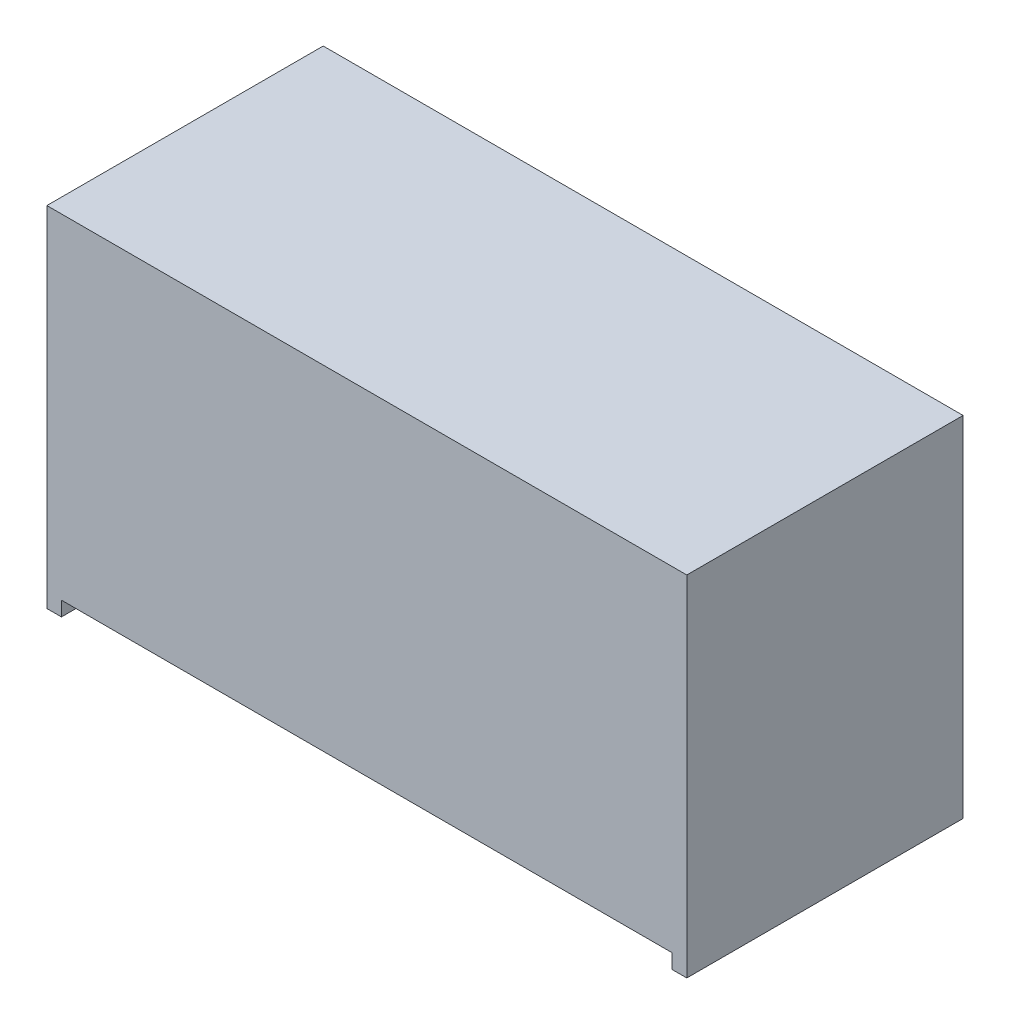
ISO-10303-21;
HEADER;
FILE_DESCRIPTION(('STEP AP214'),'2;1');
FILE_NAME('part.step','',(''),(''),'','','');
FILE_SCHEMA(('AUTOMOTIVE_DESIGN { 1 0 10303 214 1 1 1 1 }'));
ENDSEC;
DATA;
#1=APPLICATION_CONTEXT('core data for automotive mechanical design processes');
#2=APPLICATION_PROTOCOL_DEFINITION('international standard','automotive_design',2000,#1);
#3=PRODUCT_CONTEXT('',#1,'mechanical');
#4=PRODUCT('Part','Part','',(#3));
#5=PRODUCT_RELATED_PRODUCT_CATEGORY('part','',(#4));
#6=PRODUCT_DEFINITION_FORMATION('','',#4);
#7=PRODUCT_DEFINITION_CONTEXT('part definition',#1,'design');
#8=PRODUCT_DEFINITION('design','',#6,#7);
#9=PRODUCT_DEFINITION_SHAPE('','',#8);
#10=(LENGTH_UNIT() NAMED_UNIT(*) SI_UNIT(.MILLI.,.METRE.));
#11=(NAMED_UNIT(*) PLANE_ANGLE_UNIT() SI_UNIT($,.RADIAN.));
#12=(NAMED_UNIT(*) SI_UNIT($,.STERADIAN.) SOLID_ANGLE_UNIT());
#13=UNCERTAINTY_MEASURE_WITH_UNIT(LENGTH_MEASURE(1.E-05),#10,'distance_accuracy_value','');
#14=(GEOMETRIC_REPRESENTATION_CONTEXT(3) GLOBAL_UNCERTAINTY_ASSIGNED_CONTEXT((#13)) GLOBAL_UNIT_ASSIGNED_CONTEXT((#10,
#11,#12)) REPRESENTATION_CONTEXT('',''));
#15=CARTESIAN_POINT('',(0.,0.,0.));
#16=DIRECTION('',(0.,0.,1.));
#17=DIRECTION('',(1.,0.,0.));
#18=AXIS2_PLACEMENT_3D('',#15,#16,#17);
#19=CARTESIAN_POINT('',(11.,0.,4.75));
#20=DIRECTION('',(0.,1.,0.));
#21=DIRECTION('',(0.,0.,1.));
#22=AXIS2_PLACEMENT_3D('',#19,#20,#21);
#23=PLANE('',#22);
#24=DIRECTION('',(-1.,0.,0.));
#25=VECTOR('',#24,1.);
#26=CARTESIAN_POINT('',(-11.,0.,-4.75));
#27=LINE('',#26,#25);
#28=CARTESIAN_POINT('',(-10.5,0.,-4.75));
#29=VERTEX_POINT('',#28);
#30=CARTESIAN_POINT('',(-11.,0.,-4.75));
#31=VERTEX_POINT('',#30);
#32=EDGE_CURVE('E122',#29,#31,#27,.T.);
#33=ORIENTED_EDGE('',*,*,#32,.F.);
#34=DIRECTION('',(0.,0.,-1.));
#35=VECTOR('',#34,1.);
#36=CARTESIAN_POINT('',(-10.5,0.,-4.751));
#37=LINE('',#36,#35);
#38=CARTESIAN_POINT('',(-10.5,0.,4.75));
#39=VERTEX_POINT('',#38);
#40=EDGE_CURVE('E107',#39,#29,#37,.T.);
#41=ORIENTED_EDGE('',*,*,#40,.F.);
#42=DIRECTION('',(1.,0.,0.));
#43=VECTOR('',#42,1.);
#44=CARTESIAN_POINT('',(-11.,0.,4.75));
#45=LINE('',#44,#43);
#46=CARTESIAN_POINT('',(-11.,0.,4.75));
#47=VERTEX_POINT('',#46);
#48=EDGE_CURVE('E121',#47,#39,#45,.T.);
#49=ORIENTED_EDGE('',*,*,#48,.F.);
#50=DIRECTION('',(0.,0.,1.));
#51=VECTOR('',#50,1.);
#52=CARTESIAN_POINT('',(-11.,0.,-4.75));
#53=LINE('',#52,#51);
#54=EDGE_CURVE('E133',#31,#47,#53,.T.);
#55=ORIENTED_EDGE('',*,*,#54,.F.);
#56=EDGE_LOOP('',(#33,#41,#49,#55));
#57=FACE_BOUND('',#56,.T.);
#58=ADVANCED_FACE('F30',(#57),#23,.F.);
#59=CARTESIAN_POINT('',(11.,12.,-4.75));
#60=DIRECTION('',(-1.,0.,0.));
#61=DIRECTION('',(0.,0.,1.));
#62=AXIS2_PLACEMENT_3D('',#59,#60,#61);
#63=PLANE('',#62);
#64=DIRECTION('',(0.,0.,-1.));
#65=VECTOR('',#64,1.);
#66=CARTESIAN_POINT('',(11.,0.,-4.75));
#67=LINE('',#66,#65);
#68=CARTESIAN_POINT('',(11.,0.,4.75));
#69=VERTEX_POINT('',#68);
#70=CARTESIAN_POINT('',(11.,0.,-4.75));
#71=VERTEX_POINT('',#70);
#72=EDGE_CURVE('E146',#69,#71,#67,.T.);
#73=ORIENTED_EDGE('',*,*,#72,.T.);
#74=DIRECTION('',(0.,-1.,0.));
#75=VECTOR('',#74,1.);
#76=CARTESIAN_POINT('',(11.,12.,-4.75));
#77=LINE('',#76,#75);
#78=CARTESIAN_POINT('',(11.,12.,-4.75));
#79=VERTEX_POINT('',#78);
#80=EDGE_CURVE('E11',#79,#71,#77,.T.);
#81=ORIENTED_EDGE('',*,*,#80,.F.);
#82=DIRECTION('',(0.,0.,-1.));
#83=VECTOR('',#82,1.);
#84=CARTESIAN_POINT('',(11.,12.,-4.75));
#85=LINE('',#84,#83);
#86=CARTESIAN_POINT('',(11.,12.,4.75));
#87=VERTEX_POINT('',#86);
#88=EDGE_CURVE('E130',#87,#79,#85,.T.);
#89=ORIENTED_EDGE('',*,*,#88,.F.);
#90=DIRECTION('',(0.,-1.,0.));
#91=VECTOR('',#90,1.);
#92=CARTESIAN_POINT('',(11.,12.,4.75));
#93=LINE('',#92,#91);
#94=EDGE_CURVE('E137',#87,#69,#93,.T.);
#95=ORIENTED_EDGE('',*,*,#94,.T.);
#96=EDGE_LOOP('',(#73,#81,#89,#95));
#97=FACE_BOUND('',#96,.T.);
#98=ADVANCED_FACE('F32',(#97),#63,.F.);
#99=CARTESIAN_POINT('',(-11.,12.,-4.75));
#100=DIRECTION('',(0.,0.,1.));
#101=DIRECTION('',(1.,0.,0.));
#102=AXIS2_PLACEMENT_3D('',#99,#100,#101);
#103=PLANE('',#102);
#104=DIRECTION('',(1.,0.,0.));
#105=VECTOR('',#104,1.);
#106=CARTESIAN_POINT('',(-10.5,0.5,-4.75));
#107=LINE('',#106,#105);
#108=CARTESIAN_POINT('',(-10.5,0.5,-4.75));
#109=VERTEX_POINT('',#108);
#110=CARTESIAN_POINT('',(10.5,0.5,-4.75));
#111=VERTEX_POINT('',#110);
#112=EDGE_CURVE('E123',#109,#111,#107,.T.);
#113=ORIENTED_EDGE('',*,*,#112,.F.);
#114=DIRECTION('',(0.,1.,0.));
#115=VECTOR('',#114,1.);
#116=CARTESIAN_POINT('',(-10.5,-1.35112370755258,-4.75));
#117=LINE('',#116,#115);
#118=EDGE_CURVE('E115',#29,#109,#117,.T.);
#119=ORIENTED_EDGE('',*,*,#118,.F.);
#120=ORIENTED_EDGE('',*,*,#32,.T.);
#121=DIRECTION('',(0.,-1.,0.));
#122=VECTOR('',#121,1.);
#123=CARTESIAN_POINT('',(-11.,12.,-4.75));
#124=LINE('',#123,#122);
#125=CARTESIAN_POINT('',(-11.,12.,-4.75));
#126=VERTEX_POINT('',#125);
#127=EDGE_CURVE('E38',#126,#31,#124,.T.);
#128=ORIENTED_EDGE('',*,*,#127,.F.);
#129=DIRECTION('',(-1.,0.,0.));
#130=VECTOR('',#129,1.);
#131=CARTESIAN_POINT('',(-11.,12.,-4.75));
#132=LINE('',#131,#130);
#133=EDGE_CURVE('E82',#79,#126,#132,.T.);
#134=ORIENTED_EDGE('',*,*,#133,.F.);
#135=ORIENTED_EDGE('',*,*,#80,.T.);
#136=CARTESIAN_POINT('',(10.5,0.,-4.75));
#137=VERTEX_POINT('',#136);
#138=EDGE_CURVE('E144',#71,#137,#27,.T.);
#139=ORIENTED_EDGE('',*,*,#138,.T.);
#140=DIRECTION('',(0.,-1.,0.));
#141=VECTOR('',#140,1.);
#142=CARTESIAN_POINT('',(10.5,-1.35112370755258,-4.75));
#143=LINE('',#142,#141);
#144=EDGE_CURVE('E45',#111,#137,#143,.T.);
#145=ORIENTED_EDGE('',*,*,#144,.F.);
#146=EDGE_LOOP('',(#113,#119,#120,#128,#134,#135,#139,#145));
#147=FACE_BOUND('',#146,.T.);
#148=ADVANCED_FACE('F184',(#147),#103,.F.);
#149=CARTESIAN_POINT('',(-11.,12.,-4.75));
#150=DIRECTION('',(1.,0.,0.));
#151=DIRECTION('',(0.,0.,-1.));
#152=AXIS2_PLACEMENT_3D('',#149,#150,#151);
#153=PLANE('',#152);
#154=ORIENTED_EDGE('',*,*,#54,.T.);
#155=DIRECTION('',(0.,-1.,0.));
#156=VECTOR('',#155,1.);
#157=CARTESIAN_POINT('',(-11.,12.,4.75));
#158=LINE('',#157,#156);
#159=CARTESIAN_POINT('',(-11.,12.,4.75));
#160=VERTEX_POINT('',#159);
#161=EDGE_CURVE('E129',#160,#47,#158,.T.);
#162=ORIENTED_EDGE('',*,*,#161,.F.);
#163=DIRECTION('',(0.,0.,1.));
#164=VECTOR('',#163,1.);
#165=CARTESIAN_POINT('',(-11.,12.,-4.75));
#166=LINE('',#165,#164);
#167=EDGE_CURVE('E143',#126,#160,#166,.T.);
#168=ORIENTED_EDGE('',*,*,#167,.F.);
#169=ORIENTED_EDGE('',*,*,#127,.T.);
#170=EDGE_LOOP('',(#154,#162,#168,#169));
#171=FACE_BOUND('',#170,.T.);
#172=ADVANCED_FACE('F142',(#171),#153,.F.);
#173=CARTESIAN_POINT('',(-11.,12.,4.75));
#174=DIRECTION('',(0.,0.,-1.));
#175=DIRECTION('',(-1.,0.,0.));
#176=AXIS2_PLACEMENT_3D('',#173,#174,#175);
#177=PLANE('',#176);
#178=ORIENTED_EDGE('',*,*,#48,.T.);
#179=DIRECTION('',(0.,-1.,0.));
#180=VECTOR('',#179,1.);
#181=CARTESIAN_POINT('',(-10.5,-1.35112370755258,4.75));
#182=LINE('',#181,#180);
#183=CARTESIAN_POINT('',(-10.5,0.5,4.75));
#184=VERTEX_POINT('',#183);
#185=EDGE_CURVE('E104',#184,#39,#182,.T.);
#186=ORIENTED_EDGE('',*,*,#185,.F.);
#187=DIRECTION('',(-1.,0.,0.));
#188=VECTOR('',#187,1.);
#189=CARTESIAN_POINT('',(-10.5,0.5,4.75));
#190=LINE('',#189,#188);
#191=CARTESIAN_POINT('',(10.5,0.5,4.75));
#192=VERTEX_POINT('',#191);
#193=EDGE_CURVE('E156',#192,#184,#190,.T.);
#194=ORIENTED_EDGE('',*,*,#193,.F.);
#195=DIRECTION('',(0.,1.,0.));
#196=VECTOR('',#195,1.);
#197=CARTESIAN_POINT('',(10.5,-1.35112370755258,4.75));
#198=LINE('',#197,#196);
#199=CARTESIAN_POINT('',(10.5,0.,4.75));
#200=VERTEX_POINT('',#199);
#201=EDGE_CURVE('E114',#200,#192,#198,.T.);
#202=ORIENTED_EDGE('',*,*,#201,.F.);
#203=EDGE_CURVE('E75',#200,#69,#45,.T.);
#204=ORIENTED_EDGE('',*,*,#203,.T.);
#205=ORIENTED_EDGE('',*,*,#94,.F.);
#206=DIRECTION('',(1.,0.,0.));
#207=VECTOR('',#206,1.);
#208=CARTESIAN_POINT('',(-11.,12.,4.75));
#209=LINE('',#208,#207);
#210=EDGE_CURVE('E54',#160,#87,#209,.T.);
#211=ORIENTED_EDGE('',*,*,#210,.F.);
#212=ORIENTED_EDGE('',*,*,#161,.T.);
#213=EDGE_LOOP('',(#178,#186,#194,#202,#204,#205,#211,#212));
#214=FACE_BOUND('',#213,.T.);
#215=ADVANCED_FACE('F127',(#214),#177,.F.);
#216=CARTESIAN_POINT('',(11.,12.,4.75));
#217=DIRECTION('',(0.,1.,0.));
#218=DIRECTION('',(0.,0.,1.));
#219=AXIS2_PLACEMENT_3D('',#216,#217,#218);
#220=PLANE('',#219);
#221=ORIENTED_EDGE('',*,*,#88,.T.);
#222=ORIENTED_EDGE('',*,*,#133,.T.);
#223=ORIENTED_EDGE('',*,*,#167,.T.);
#224=ORIENTED_EDGE('',*,*,#210,.T.);
#225=EDGE_LOOP('',(#221,#222,#223,#224));
#226=FACE_BOUND('',#225,.T.);
#227=ADVANCED_FACE('F170',(#226),#220,.T.);
#228=ORIENTED_EDGE('',*,*,#203,.F.);
#229=DIRECTION('',(0.,0.,1.));
#230=VECTOR('',#229,1.);
#231=CARTESIAN_POINT('',(10.5,0.,-4.751));
#232=LINE('',#231,#230);
#233=EDGE_CURVE('E124',#137,#200,#232,.T.);
#234=ORIENTED_EDGE('',*,*,#233,.F.);
#235=ORIENTED_EDGE('',*,*,#138,.F.);
#236=ORIENTED_EDGE('',*,*,#72,.F.);
#237=EDGE_LOOP('',(#228,#234,#235,#236));
#238=FACE_BOUND('',#237,.T.);
#239=ADVANCED_FACE('F166',(#238),#23,.F.);
#240=CARTESIAN_POINT('',(-10.5,-1.35112370755258,-4.751));
#241=DIRECTION('',(-1.,0.,0.));
#242=DIRECTION('',(0.,0.,1.));
#243=AXIS2_PLACEMENT_3D('',#240,#241,#242);
#244=PLANE('',#243);
#245=ORIENTED_EDGE('',*,*,#118,.T.);
#246=DIRECTION('',(0.,0.,1.));
#247=VECTOR('',#246,1.);
#248=CARTESIAN_POINT('',(-10.5,0.5,-4.751));
#249=LINE('',#248,#247);
#250=EDGE_CURVE('E110',#109,#184,#249,.T.);
#251=ORIENTED_EDGE('',*,*,#250,.T.);
#252=ORIENTED_EDGE('',*,*,#185,.T.);
#253=ORIENTED_EDGE('',*,*,#40,.T.);
#254=EDGE_LOOP('',(#245,#251,#252,#253));
#255=FACE_BOUND('',#254,.T.);
#256=ADVANCED_FACE('F106',(#255),#244,.F.);
#257=CARTESIAN_POINT('',(-10.5,0.5,-4.751));
#258=DIRECTION('',(0.,1.,0.));
#259=DIRECTION('',(0.,0.,1.));
#260=AXIS2_PLACEMENT_3D('',#257,#258,#259);
#261=PLANE('',#260);
#262=ORIENTED_EDGE('',*,*,#112,.T.);
#263=DIRECTION('',(0.,0.,1.));
#264=VECTOR('',#263,1.);
#265=CARTESIAN_POINT('',(10.5,0.5,-4.751));
#266=LINE('',#265,#264);
#267=EDGE_CURVE('E154',#111,#192,#266,.T.);
#268=ORIENTED_EDGE('',*,*,#267,.T.);
#269=ORIENTED_EDGE('',*,*,#193,.T.);
#270=ORIENTED_EDGE('',*,*,#250,.F.);
#271=EDGE_LOOP('',(#262,#268,#269,#270));
#272=FACE_BOUND('',#271,.T.);
#273=ADVANCED_FACE('F192',(#272),#261,.F.);
#274=CARTESIAN_POINT('',(10.5,-1.35112370755258,-4.751));
#275=DIRECTION('',(1.,0.,0.));
#276=DIRECTION('',(0.,0.,-1.));
#277=AXIS2_PLACEMENT_3D('',#274,#275,#276);
#278=PLANE('',#277);
#279=ORIENTED_EDGE('',*,*,#144,.T.);
#280=ORIENTED_EDGE('',*,*,#233,.T.);
#281=ORIENTED_EDGE('',*,*,#201,.T.);
#282=ORIENTED_EDGE('',*,*,#267,.F.);
#283=EDGE_LOOP('',(#279,#280,#281,#282));
#284=FACE_BOUND('',#283,.T.);
#285=ADVANCED_FACE('F163',(#284),#278,.F.);
#286=CLOSED_SHELL('',(#58,#98,#148,#172,#215,#227,#239,#256,#273,#285));
#287=MANIFOLD_SOLID_BREP('B2',#286);
#288=ADVANCED_BREP_SHAPE_REPRESENTATION('',(#18,#287),#14);
#289=SHAPE_DEFINITION_REPRESENTATION(#9,#288);
ENDSEC;
END-ISO-10303-21;
